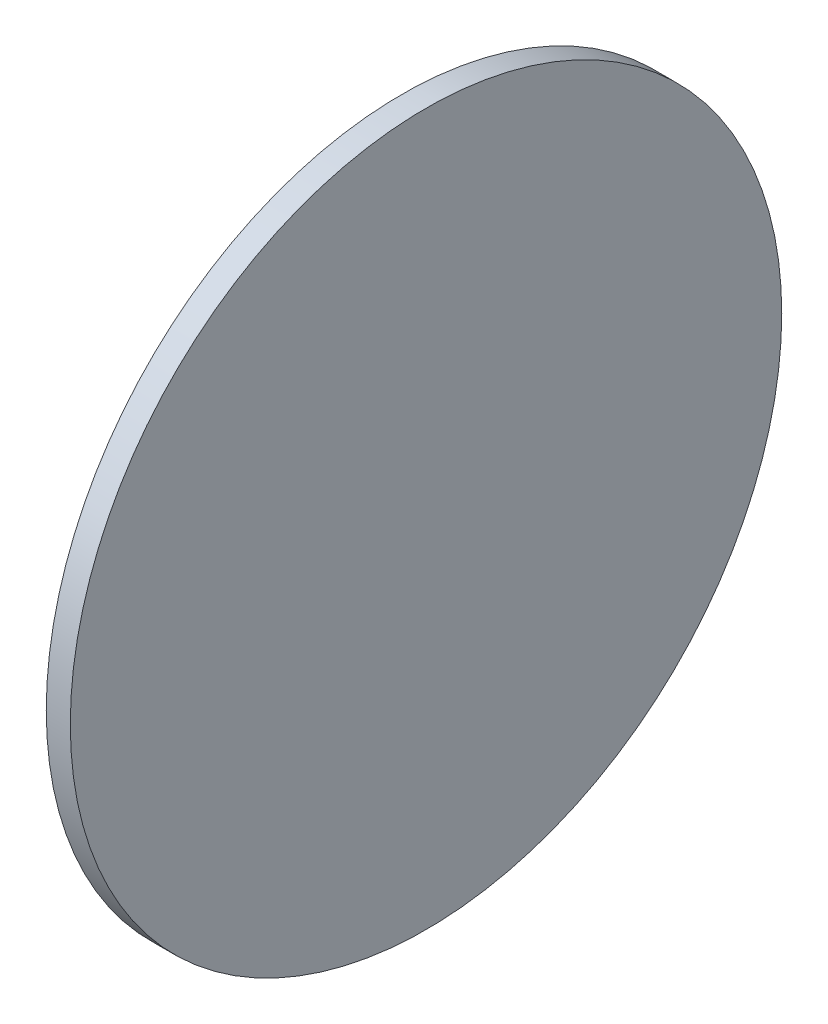
ISO-10303-21;
HEADER;
FILE_DESCRIPTION(('STEP AP214'),'2;1');
FILE_NAME('part.step','',(''),(''),'','','');
FILE_SCHEMA(('AUTOMOTIVE_DESIGN { 1 0 10303 214 1 1 1 1 }'));
ENDSEC;
DATA;
#1=APPLICATION_CONTEXT('core data for automotive mechanical design processes');
#2=APPLICATION_PROTOCOL_DEFINITION('international standard','automotive_design',2000,#1);
#3=PRODUCT_CONTEXT('',#1,'mechanical');
#4=PRODUCT('Part','Part','',(#3));
#5=PRODUCT_RELATED_PRODUCT_CATEGORY('part','',(#4));
#6=PRODUCT_DEFINITION_FORMATION('','',#4);
#7=PRODUCT_DEFINITION_CONTEXT('part definition',#1,'design');
#8=PRODUCT_DEFINITION('design','',#6,#7);
#9=PRODUCT_DEFINITION_SHAPE('','',#8);
#10=(LENGTH_UNIT() NAMED_UNIT(*) SI_UNIT(.MILLI.,.METRE.));
#11=(NAMED_UNIT(*) PLANE_ANGLE_UNIT() SI_UNIT($,.RADIAN.));
#12=(NAMED_UNIT(*) SI_UNIT($,.STERADIAN.) SOLID_ANGLE_UNIT());
#13=UNCERTAINTY_MEASURE_WITH_UNIT(LENGTH_MEASURE(1.E-05),#10,'distance_accuracy_value','');
#14=(GEOMETRIC_REPRESENTATION_CONTEXT(3) GLOBAL_UNCERTAINTY_ASSIGNED_CONTEXT((#13)) GLOBAL_UNIT_ASSIGNED_CONTEXT((#10,
#11,#12)) REPRESENTATION_CONTEXT('',''));
#15=CARTESIAN_POINT('',(0.,0.,0.));
#16=DIRECTION('',(0.,0.,1.));
#17=DIRECTION('',(1.,0.,0.));
#18=AXIS2_PLACEMENT_3D('',#15,#16,#17);
#19=CARTESIAN_POINT('',(76.84,0.,0.));
#20=DIRECTION('',(-1.,0.,0.));
#21=DIRECTION('',(0.,0.,1.));
#22=AXIS2_PLACEMENT_3D('',#19,#20,#21);
#23=PLANE('',#22);
#24=CARTESIAN_POINT('',(76.84,0.,0.));
#25=DIRECTION('',(-1.,0.,0.));
#26=DIRECTION('',(0.,0.,1.));
#27=AXIS2_PLACEMENT_3D('',#24,#25,#26);
#28=CIRCLE('',#27,7.4);
#29=CARTESIAN_POINT('',(76.84,0.,7.4));
#30=VERTEX_POINT('',#29);
#31=EDGE_CURVE('E18',#30,#30,#28,.F.);
#32=ORIENTED_EDGE('',*,*,#31,.F.);
#33=EDGE_LOOP('',(#32));
#34=FACE_BOUND('',#33,.T.);
#35=ADVANCED_FACE('F15',(#34),#23,.T.);
#36=CARTESIAN_POINT('',(77.09,0.,0.));
#37=DIRECTION('',(-1.,0.,0.));
#38=DIRECTION('',(0.,0.,1.));
#39=AXIS2_PLACEMENT_3D('',#36,#37,#38);
#40=CYLINDRICAL_SURFACE('',#39,7.4);
#41=CARTESIAN_POINT('',(77.34,0.,0.));
#42=DIRECTION('',(-1.,0.,0.));
#43=DIRECTION('',(0.,0.,1.));
#44=AXIS2_PLACEMENT_3D('',#41,#42,#43);
#45=CIRCLE('',#44,7.4);
#46=CARTESIAN_POINT('',(77.34,0.,7.4));
#47=VERTEX_POINT('',#46);
#48=EDGE_CURVE('E10',#47,#47,#45,.F.);
#49=ORIENTED_EDGE('',*,*,#48,.F.);
#50=EDGE_LOOP('',(#49));
#51=FACE_BOUND('',#50,.T.);
#52=ORIENTED_EDGE('',*,*,#31,.T.);
#53=EDGE_LOOP('',(#52));
#54=FACE_BOUND('',#53,.T.);
#55=ADVANCED_FACE('F27',(#51,#54),#40,.T.);
#56=CARTESIAN_POINT('',(77.34,0.,0.));
#57=DIRECTION('',(1.,0.,0.));
#58=DIRECTION('',(0.,0.,-1.));
#59=AXIS2_PLACEMENT_3D('',#56,#57,#58);
#60=PLANE('',#59);
#61=ORIENTED_EDGE('',*,*,#48,.T.);
#62=EDGE_LOOP('',(#61));
#63=FACE_BOUND('',#62,.T.);
#64=ADVANCED_FACE('F34',(#63),#60,.T.);
#65=CLOSED_SHELL('',(#35,#55,#64));
#66=MANIFOLD_SOLID_BREP('B1',#65);
#67=ADVANCED_BREP_SHAPE_REPRESENTATION('',(#18,#66),#14);
#68=SHAPE_DEFINITION_REPRESENTATION(#9,#67);
ENDSEC;
END-ISO-10303-21;
